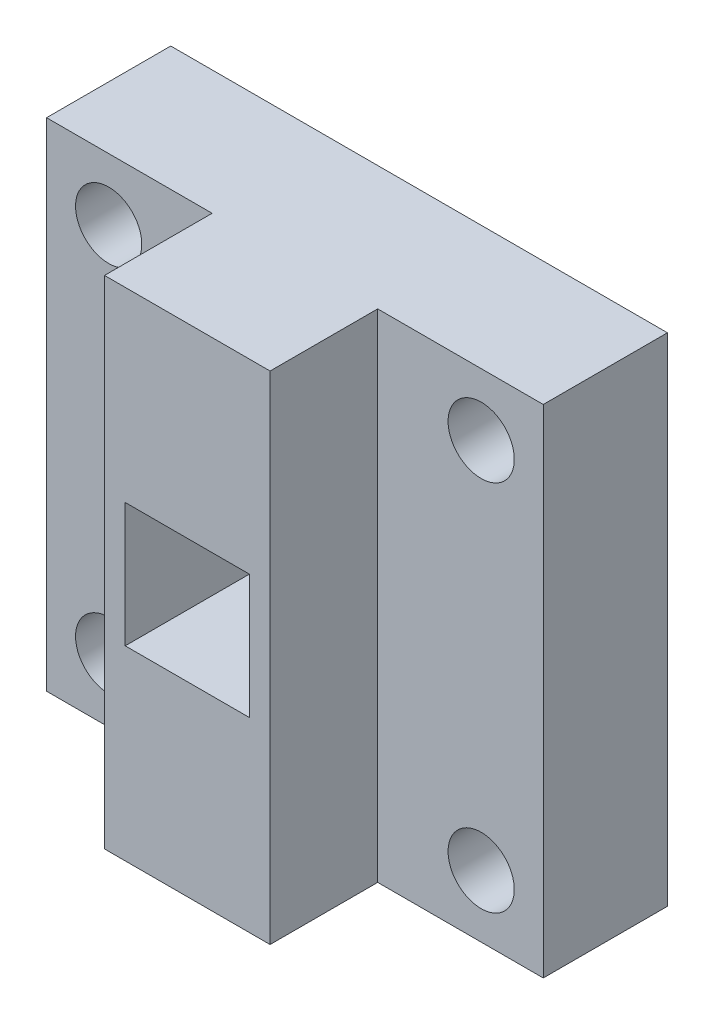
ISO-10303-21;
HEADER;
FILE_DESCRIPTION(('STEP AP214'),'2;1');
FILE_NAME('part.step','',(''),(''),'','','');
FILE_SCHEMA(('AUTOMOTIVE_DESIGN { 1 0 10303 214 1 1 1 1 }'));
ENDSEC;
DATA;
#1=APPLICATION_CONTEXT('core data for automotive mechanical design processes');
#2=APPLICATION_PROTOCOL_DEFINITION('international standard','automotive_design',2000,#1);
#3=PRODUCT_CONTEXT('',#1,'mechanical');
#4=PRODUCT('Part','Part','',(#3));
#5=PRODUCT_RELATED_PRODUCT_CATEGORY('part','',(#4));
#6=PRODUCT_DEFINITION_FORMATION('','',#4);
#7=PRODUCT_DEFINITION_CONTEXT('part definition',#1,'design');
#8=PRODUCT_DEFINITION('design','',#6,#7);
#9=PRODUCT_DEFINITION_SHAPE('','',#8);
#10=(LENGTH_UNIT() NAMED_UNIT(*) SI_UNIT(.MILLI.,.METRE.));
#11=(NAMED_UNIT(*) PLANE_ANGLE_UNIT() SI_UNIT($,.RADIAN.));
#12=(NAMED_UNIT(*) SI_UNIT($,.STERADIAN.) SOLID_ANGLE_UNIT());
#13=UNCERTAINTY_MEASURE_WITH_UNIT(LENGTH_MEASURE(1.E-05),#10,'distance_accuracy_value','');
#14=(GEOMETRIC_REPRESENTATION_CONTEXT(3) GLOBAL_UNCERTAINTY_ASSIGNED_CONTEXT((#13)) GLOBAL_UNIT_ASSIGNED_CONTEXT((#10,
#11,#12)) REPRESENTATION_CONTEXT('',''));
#15=CARTESIAN_POINT('',(0.,0.,0.));
#16=DIRECTION('',(0.,0.,1.));
#17=DIRECTION('',(1.,0.,0.));
#18=AXIS2_PLACEMENT_3D('',#15,#16,#17);
#19=CARTESIAN_POINT('',(0.,0.,0.));
#20=DIRECTION('',(0.,0.,-1.));
#21=DIRECTION('',(-1.,0.,0.));
#22=AXIS2_PLACEMENT_3D('',#19,#20,#21);
#23=PLANE('',#22);
#24=CARTESIAN_POINT('',(22.5,22.5,0.));
#25=DIRECTION('',(0.,0.,1.));
#26=DIRECTION('',(-1.,0.,0.));
#27=AXIS2_PLACEMENT_3D('',#24,#25,#26);
#28=CIRCLE('',#27,4.);
#29=CARTESIAN_POINT('',(18.5,22.5,0.));
#30=VERTEX_POINT('',#29);
#31=EDGE_CURVE('E192',#30,#30,#28,.T.);
#32=ORIENTED_EDGE('',*,*,#31,.T.);
#33=EDGE_LOOP('',(#32));
#34=FACE_BOUND('',#33,.T.);
#35=CARTESIAN_POINT('',(22.5,-22.5,0.));
#36=DIRECTION('',(0.,0.,-1.));
#37=DIRECTION('',(-1.,0.,0.));
#38=AXIS2_PLACEMENT_3D('',#35,#36,#37);
#39=CIRCLE('',#38,4.);
#40=CARTESIAN_POINT('',(18.5,-22.5,0.));
#41=VERTEX_POINT('',#40);
#42=EDGE_CURVE('E208',#41,#41,#39,.T.);
#43=ORIENTED_EDGE('',*,*,#42,.F.);
#44=EDGE_LOOP('',(#43));
#45=FACE_BOUND('',#44,.T.);
#46=DIRECTION('',(0.,1.,0.));
#47=VECTOR('',#46,1.);
#48=CARTESIAN_POINT('',(7.5,-7.5,0.));
#49=LINE('',#48,#47);
#50=CARTESIAN_POINT('',(7.5,-7.5,0.));
#51=VERTEX_POINT('',#50);
#52=CARTESIAN_POINT('',(7.5,7.5,0.));
#53=VERTEX_POINT('',#52);
#54=EDGE_CURVE('E128',#51,#53,#49,.T.);
#55=ORIENTED_EDGE('',*,*,#54,.T.);
#56=DIRECTION('',(-1.,0.,0.));
#57=VECTOR('',#56,1.);
#58=CARTESIAN_POINT('',(-7.5,7.5,0.));
#59=LINE('',#58,#57);
#60=CARTESIAN_POINT('',(-7.5,7.5,0.));
#61=VERTEX_POINT('',#60);
#62=EDGE_CURVE('E137',#53,#61,#59,.T.);
#63=ORIENTED_EDGE('',*,*,#62,.T.);
#64=DIRECTION('',(0.,-1.,0.));
#65=VECTOR('',#64,1.);
#66=CARTESIAN_POINT('',(-7.5,-7.5,0.));
#67=LINE('',#66,#65);
#68=CARTESIAN_POINT('',(-7.5,-7.5,0.));
#69=VERTEX_POINT('',#68);
#70=EDGE_CURVE('E52',#61,#69,#67,.T.);
#71=ORIENTED_EDGE('',*,*,#70,.T.);
#72=DIRECTION('',(1.,0.,0.));
#73=VECTOR('',#72,1.);
#74=CARTESIAN_POINT('',(-7.5,-7.5,0.));
#75=LINE('',#74,#73);
#76=EDGE_CURVE('E134',#69,#51,#75,.T.);
#77=ORIENTED_EDGE('',*,*,#76,.T.);
#78=EDGE_LOOP('',(#55,#63,#71,#77));
#79=FACE_BOUND('',#78,.T.);
#80=DIRECTION('',(0.,1.,0.));
#81=VECTOR('',#80,1.);
#82=CARTESIAN_POINT('',(30.,-30.,0.));
#83=LINE('',#82,#81);
#84=CARTESIAN_POINT('',(30.,-30.,0.));
#85=VERTEX_POINT('',#84);
#86=CARTESIAN_POINT('',(30.,30.,0.));
#87=VERTEX_POINT('',#86);
#88=EDGE_CURVE('E269',#85,#87,#83,.T.);
#89=ORIENTED_EDGE('',*,*,#88,.F.);
#90=DIRECTION('',(1.,0.,0.));
#91=VECTOR('',#90,1.);
#92=CARTESIAN_POINT('',(-30.,-30.,0.));
#93=LINE('',#92,#91);
#94=CARTESIAN_POINT('',(-30.,-30.,0.));
#95=VERTEX_POINT('',#94);
#96=EDGE_CURVE('E278',#95,#85,#93,.T.);
#97=ORIENTED_EDGE('',*,*,#96,.F.);
#98=DIRECTION('',(0.,-1.,0.));
#99=VECTOR('',#98,1.);
#100=CARTESIAN_POINT('',(-30.,-30.,0.));
#101=LINE('',#100,#99);
#102=CARTESIAN_POINT('',(-30.,30.,0.));
#103=VERTEX_POINT('',#102);
#104=EDGE_CURVE('E268',#103,#95,#101,.T.);
#105=ORIENTED_EDGE('',*,*,#104,.F.);
#106=DIRECTION('',(-1.,0.,0.));
#107=VECTOR('',#106,1.);
#108=CARTESIAN_POINT('',(-30.,30.,0.));
#109=LINE('',#108,#107);
#110=EDGE_CURVE('E260',#87,#103,#109,.T.);
#111=ORIENTED_EDGE('',*,*,#110,.F.);
#112=EDGE_LOOP('',(#89,#97,#105,#111));
#113=FACE_BOUND('',#112,.T.);
#114=CARTESIAN_POINT('',(-22.5,22.5,0.));
#115=DIRECTION('',(0.,0.,-1.));
#116=DIRECTION('',(1.,0.,0.));
#117=AXIS2_PLACEMENT_3D('',#114,#115,#116);
#118=CIRCLE('',#117,4.);
#119=CARTESIAN_POINT('',(-18.5,22.5,0.));
#120=VERTEX_POINT('',#119);
#121=EDGE_CURVE('E193',#120,#120,#118,.T.);
#122=ORIENTED_EDGE('',*,*,#121,.F.);
#123=EDGE_LOOP('',(#122));
#124=FACE_BOUND('',#123,.T.);
#125=CARTESIAN_POINT('',(-22.5,-22.5,0.));
#126=DIRECTION('',(0.,0.,1.));
#127=DIRECTION('',(1.,0.,0.));
#128=AXIS2_PLACEMENT_3D('',#125,#126,#127);
#129=CIRCLE('',#128,4.);
#130=CARTESIAN_POINT('',(-18.5,-22.5,0.));
#131=VERTEX_POINT('',#130);
#132=EDGE_CURVE('E204',#131,#131,#129,.T.);
#133=ORIENTED_EDGE('',*,*,#132,.T.);
#134=EDGE_LOOP('',(#133));
#135=FACE_BOUND('',#134,.T.);
#136=ADVANCED_FACE('F35',(#34,#45,#79,#113,#124,#135),#23,.T.);
#137=CARTESIAN_POINT('',(0.,0.,15.));
#138=DIRECTION('',(0.,0.,-1.));
#139=DIRECTION('',(-1.,0.,0.));
#140=AXIS2_PLACEMENT_3D('',#137,#138,#139);
#141=PLANE('',#140);
#142=DIRECTION('',(0.,-1.,0.));
#143=VECTOR('',#142,1.);
#144=CARTESIAN_POINT('',(-10.,-30.,15.));
#145=LINE('',#144,#143);
#146=CARTESIAN_POINT('',(-10.,30.,15.));
#147=VERTEX_POINT('',#146);
#148=CARTESIAN_POINT('',(-10.,-30.,15.));
#149=VERTEX_POINT('',#148);
#150=EDGE_CURVE('E169',#147,#149,#145,.T.);
#151=ORIENTED_EDGE('',*,*,#150,.F.);
#152=DIRECTION('',(-1.,0.,0.));
#153=VECTOR('',#152,1.);
#154=CARTESIAN_POINT('',(-30.,30.,15.));
#155=LINE('',#154,#153);
#156=CARTESIAN_POINT('',(-30.,30.,15.));
#157=VERTEX_POINT('',#156);
#158=EDGE_CURVE('E292',#147,#157,#155,.T.);
#159=ORIENTED_EDGE('',*,*,#158,.T.);
#160=DIRECTION('',(0.,-1.,0.));
#161=VECTOR('',#160,1.);
#162=CARTESIAN_POINT('',(-30.,-30.,15.));
#163=LINE('',#162,#161);
#164=CARTESIAN_POINT('',(-30.,-30.,15.));
#165=VERTEX_POINT('',#164);
#166=EDGE_CURVE('E273',#157,#165,#163,.T.);
#167=ORIENTED_EDGE('',*,*,#166,.T.);
#168=DIRECTION('',(1.,0.,0.));
#169=VECTOR('',#168,1.);
#170=CARTESIAN_POINT('',(-30.,-30.,15.));
#171=LINE('',#170,#169);
#172=EDGE_CURVE('E287',#165,#149,#171,.T.);
#173=ORIENTED_EDGE('',*,*,#172,.T.);
#174=EDGE_LOOP('',(#151,#159,#167,#173));
#175=FACE_BOUND('',#174,.T.);
#176=CARTESIAN_POINT('',(-22.5,22.5,15.));
#177=DIRECTION('',(0.,0.,-1.));
#178=DIRECTION('',(-1.,0.,0.));
#179=AXIS2_PLACEMENT_3D('',#176,#177,#178);
#180=CIRCLE('',#179,4.);
#181=CARTESIAN_POINT('',(-26.5,22.5,15.));
#182=VERTEX_POINT('',#181);
#183=EDGE_CURVE('E190',#182,#182,#180,.T.);
#184=ORIENTED_EDGE('',*,*,#183,.T.);
#185=EDGE_LOOP('',(#184));
#186=FACE_BOUND('',#185,.T.);
#187=CARTESIAN_POINT('',(-22.5,-22.5,15.));
#188=DIRECTION('',(0.,0.,-1.));
#189=DIRECTION('',(-1.,0.,0.));
#190=AXIS2_PLACEMENT_3D('',#187,#188,#189);
#191=CIRCLE('',#190,4.);
#192=CARTESIAN_POINT('',(-26.5,-22.5,15.));
#193=VERTEX_POINT('',#192);
#194=EDGE_CURVE('E39',#193,#193,#191,.F.);
#195=ORIENTED_EDGE('',*,*,#194,.F.);
#196=EDGE_LOOP('',(#195));
#197=FACE_BOUND('',#196,.T.);
#198=ADVANCED_FACE('F233',(#175,#186,#197),#141,.F.);
#199=DIRECTION('',(0.,1.,0.));
#200=VECTOR('',#199,1.);
#201=CARTESIAN_POINT('',(10.,-30.,15.));
#202=LINE('',#201,#200);
#203=CARTESIAN_POINT('',(10.,-30.,15.));
#204=VERTEX_POINT('',#203);
#205=CARTESIAN_POINT('',(10.,30.,15.));
#206=VERTEX_POINT('',#205);
#207=EDGE_CURVE('E161',#204,#206,#202,.T.);
#208=ORIENTED_EDGE('',*,*,#207,.F.);
#209=CARTESIAN_POINT('',(30.,-30.,15.));
#210=VERTEX_POINT('',#209);
#211=EDGE_CURVE('E298',#204,#210,#171,.T.);
#212=ORIENTED_EDGE('',*,*,#211,.T.);
#213=DIRECTION('',(0.,1.,0.));
#214=VECTOR('',#213,1.);
#215=CARTESIAN_POINT('',(30.,-30.,15.));
#216=LINE('',#215,#214);
#217=CARTESIAN_POINT('',(30.,30.,15.));
#218=VERTEX_POINT('',#217);
#219=EDGE_CURVE('E280',#210,#218,#216,.T.);
#220=ORIENTED_EDGE('',*,*,#219,.T.);
#221=EDGE_CURVE('E289',#218,#206,#155,.T.);
#222=ORIENTED_EDGE('',*,*,#221,.T.);
#223=EDGE_LOOP('',(#208,#212,#220,#222));
#224=FACE_BOUND('',#223,.T.);
#225=CARTESIAN_POINT('',(22.5,-22.5,15.));
#226=DIRECTION('',(0.,0.,-1.));
#227=DIRECTION('',(-1.,0.,0.));
#228=AXIS2_PLACEMENT_3D('',#225,#226,#227);
#229=CIRCLE('',#228,4.);
#230=CARTESIAN_POINT('',(18.5,-22.5,15.));
#231=VERTEX_POINT('',#230);
#232=EDGE_CURVE('E149',#231,#231,#229,.T.);
#233=ORIENTED_EDGE('',*,*,#232,.T.);
#234=EDGE_LOOP('',(#233));
#235=FACE_BOUND('',#234,.T.);
#236=CARTESIAN_POINT('',(22.5,22.5,15.));
#237=DIRECTION('',(0.,0.,-1.));
#238=DIRECTION('',(-1.,0.,0.));
#239=AXIS2_PLACEMENT_3D('',#236,#237,#238);
#240=CIRCLE('',#239,4.);
#241=CARTESIAN_POINT('',(18.5,22.5,15.));
#242=VERTEX_POINT('',#241);
#243=EDGE_CURVE('E197',#242,#242,#240,.F.);
#244=ORIENTED_EDGE('',*,*,#243,.F.);
#245=EDGE_LOOP('',(#244));
#246=FACE_BOUND('',#245,.T.);
#247=ADVANCED_FACE('F215',(#224,#235,#246),#141,.F.);
#248=CARTESIAN_POINT('',(30.,-30.,15.));
#249=DIRECTION('',(-1.,0.,0.));
#250=DIRECTION('',(0.,0.,1.));
#251=AXIS2_PLACEMENT_3D('',#248,#249,#250);
#252=PLANE('',#251);
#253=ORIENTED_EDGE('',*,*,#88,.T.);
#254=DIRECTION('',(0.,0.,-1.));
#255=VECTOR('',#254,1.);
#256=CARTESIAN_POINT('',(30.,30.,15.));
#257=LINE('',#256,#255);
#258=EDGE_CURVE('E11',#218,#87,#257,.T.);
#259=ORIENTED_EDGE('',*,*,#258,.F.);
#260=ORIENTED_EDGE('',*,*,#219,.F.);
#261=DIRECTION('',(0.,0.,-1.));
#262=VECTOR('',#261,1.);
#263=CARTESIAN_POINT('',(30.,-30.,15.));
#264=LINE('',#263,#262);
#265=EDGE_CURVE('E284',#210,#85,#264,.T.);
#266=ORIENTED_EDGE('',*,*,#265,.T.);
#267=EDGE_LOOP('',(#253,#259,#260,#266));
#268=FACE_BOUND('',#267,.T.);
#269=ADVANCED_FACE('F37',(#268),#252,.F.);
#270=CARTESIAN_POINT('',(-30.,30.,15.));
#271=DIRECTION('',(0.,-1.,0.));
#272=DIRECTION('',(0.,0.,-1.));
#273=AXIS2_PLACEMENT_3D('',#270,#271,#272);
#274=PLANE('',#273);
#275=ORIENTED_EDGE('',*,*,#110,.T.);
#276=DIRECTION('',(0.,0.,-1.));
#277=VECTOR('',#276,1.);
#278=CARTESIAN_POINT('',(-30.,30.,15.));
#279=LINE('',#278,#277);
#280=EDGE_CURVE('E44',#157,#103,#279,.T.);
#281=ORIENTED_EDGE('',*,*,#280,.F.);
#282=ORIENTED_EDGE('',*,*,#158,.F.);
#283=DIRECTION('',(0.,0.,-1.));
#284=VECTOR('',#283,1.);
#285=CARTESIAN_POINT('',(-10.,30.,28.));
#286=LINE('',#285,#284);
#287=CARTESIAN_POINT('',(-10.,30.,28.));
#288=VERTEX_POINT('',#287);
#289=EDGE_CURVE('E313',#288,#147,#286,.T.);
#290=ORIENTED_EDGE('',*,*,#289,.F.);
#291=DIRECTION('',(-1.,0.,0.));
#292=VECTOR('',#291,1.);
#293=CARTESIAN_POINT('',(-10.,30.,28.));
#294=LINE('',#293,#292);
#295=CARTESIAN_POINT('',(10.,30.,28.));
#296=VERTEX_POINT('',#295);
#297=EDGE_CURVE('E168',#296,#288,#294,.T.);
#298=ORIENTED_EDGE('',*,*,#297,.F.);
#299=DIRECTION('',(0.,0.,-1.));
#300=VECTOR('',#299,1.);
#301=CARTESIAN_POINT('',(10.,30.,28.));
#302=LINE('',#301,#300);
#303=EDGE_CURVE('E319',#296,#206,#302,.T.);
#304=ORIENTED_EDGE('',*,*,#303,.T.);
#305=ORIENTED_EDGE('',*,*,#221,.F.);
#306=ORIENTED_EDGE('',*,*,#258,.T.);
#307=EDGE_LOOP('',(#275,#281,#282,#290,#298,#304,#305,#306));
#308=FACE_BOUND('',#307,.T.);
#309=ADVANCED_FACE('F251',(#308),#274,.F.);
#310=CARTESIAN_POINT('',(-30.,-30.,15.));
#311=DIRECTION('',(1.,0.,0.));
#312=DIRECTION('',(0.,0.,-1.));
#313=AXIS2_PLACEMENT_3D('',#310,#311,#312);
#314=PLANE('',#313);
#315=ORIENTED_EDGE('',*,*,#104,.T.);
#316=DIRECTION('',(0.,0.,-1.));
#317=VECTOR('',#316,1.);
#318=CARTESIAN_POINT('',(-30.,-30.,15.));
#319=LINE('',#318,#317);
#320=EDGE_CURVE('E274',#165,#95,#319,.T.);
#321=ORIENTED_EDGE('',*,*,#320,.F.);
#322=ORIENTED_EDGE('',*,*,#166,.F.);
#323=ORIENTED_EDGE('',*,*,#280,.T.);
#324=EDGE_LOOP('',(#315,#321,#322,#323));
#325=FACE_BOUND('',#324,.T.);
#326=ADVANCED_FACE('F248',(#325),#314,.F.);
#327=CARTESIAN_POINT('',(-30.,-30.,15.));
#328=DIRECTION('',(0.,1.,0.));
#329=DIRECTION('',(0.,0.,1.));
#330=AXIS2_PLACEMENT_3D('',#327,#328,#329);
#331=PLANE('',#330);
#332=ORIENTED_EDGE('',*,*,#96,.T.);
#333=ORIENTED_EDGE('',*,*,#265,.F.);
#334=ORIENTED_EDGE('',*,*,#211,.F.);
#335=DIRECTION('',(0.,0.,-1.));
#336=VECTOR('',#335,1.);
#337=CARTESIAN_POINT('',(10.,-30.,28.));
#338=LINE('',#337,#336);
#339=CARTESIAN_POINT('',(10.,-30.,28.));
#340=VERTEX_POINT('',#339);
#341=EDGE_CURVE('E175',#340,#204,#338,.T.);
#342=ORIENTED_EDGE('',*,*,#341,.F.);
#343=DIRECTION('',(1.,0.,0.));
#344=VECTOR('',#343,1.);
#345=CARTESIAN_POINT('',(-10.,-30.,28.));
#346=LINE('',#345,#344);
#347=CARTESIAN_POINT('',(-10.,-30.,28.));
#348=VERTEX_POINT('',#347);
#349=EDGE_CURVE('E173',#348,#340,#346,.T.);
#350=ORIENTED_EDGE('',*,*,#349,.F.);
#351=DIRECTION('',(0.,0.,-1.));
#352=VECTOR('',#351,1.);
#353=CARTESIAN_POINT('',(-10.,-30.,28.));
#354=LINE('',#353,#352);
#355=EDGE_CURVE('E188',#348,#149,#354,.T.);
#356=ORIENTED_EDGE('',*,*,#355,.T.);
#357=ORIENTED_EDGE('',*,*,#172,.F.);
#358=ORIENTED_EDGE('',*,*,#320,.T.);
#359=EDGE_LOOP('',(#332,#333,#334,#342,#350,#356,#357,#358));
#360=FACE_BOUND('',#359,.T.);
#361=ADVANCED_FACE('F244',(#360),#331,.F.);
#362=CARTESIAN_POINT('',(10.,-30.,28.));
#363=DIRECTION('',(-1.,0.,0.));
#364=DIRECTION('',(0.,0.,1.));
#365=AXIS2_PLACEMENT_3D('',#362,#363,#364);
#366=PLANE('',#365);
#367=ORIENTED_EDGE('',*,*,#207,.T.);
#368=ORIENTED_EDGE('',*,*,#303,.F.);
#369=DIRECTION('',(0.,1.,0.));
#370=VECTOR('',#369,1.);
#371=CARTESIAN_POINT('',(10.,-30.,28.));
#372=LINE('',#371,#370);
#373=EDGE_CURVE('E165',#340,#296,#372,.T.);
#374=ORIENTED_EDGE('',*,*,#373,.F.);
#375=ORIENTED_EDGE('',*,*,#341,.T.);
#376=EDGE_LOOP('',(#367,#368,#374,#375));
#377=FACE_BOUND('',#376,.T.);
#378=ADVANCED_FACE('F247',(#377),#366,.F.);
#379=CARTESIAN_POINT('',(-10.,-30.,28.));
#380=DIRECTION('',(1.,0.,0.));
#381=DIRECTION('',(0.,0.,-1.));
#382=AXIS2_PLACEMENT_3D('',#379,#380,#381);
#383=PLANE('',#382);
#384=ORIENTED_EDGE('',*,*,#150,.T.);
#385=ORIENTED_EDGE('',*,*,#355,.F.);
#386=DIRECTION('',(0.,-1.,0.));
#387=VECTOR('',#386,1.);
#388=CARTESIAN_POINT('',(-10.,-30.,28.));
#389=LINE('',#388,#387);
#390=EDGE_CURVE('E171',#288,#348,#389,.T.);
#391=ORIENTED_EDGE('',*,*,#390,.F.);
#392=ORIENTED_EDGE('',*,*,#289,.T.);
#393=EDGE_LOOP('',(#384,#385,#391,#392));
#394=FACE_BOUND('',#393,.T.);
#395=ADVANCED_FACE('F316',(#394),#383,.F.);
#396=CARTESIAN_POINT('',(0.,0.,28.));
#397=DIRECTION('',(0.,0.,-1.));
#398=DIRECTION('',(-1.,0.,0.));
#399=AXIS2_PLACEMENT_3D('',#396,#397,#398);
#400=PLANE('',#399);
#401=DIRECTION('',(-1.,0.,0.));
#402=VECTOR('',#401,1.);
#403=CARTESIAN_POINT('',(-7.5,7.5,28.));
#404=LINE('',#403,#402);
#405=CARTESIAN_POINT('',(7.5,7.5,28.));
#406=VERTEX_POINT('',#405);
#407=CARTESIAN_POINT('',(-7.5,7.5,28.));
#408=VERTEX_POINT('',#407);
#409=EDGE_CURVE('E155',#406,#408,#404,.T.);
#410=ORIENTED_EDGE('',*,*,#409,.F.);
#411=DIRECTION('',(0.,1.,0.));
#412=VECTOR('',#411,1.);
#413=CARTESIAN_POINT('',(7.5,-7.5,28.));
#414=LINE('',#413,#412);
#415=CARTESIAN_POINT('',(7.5,-7.5,28.));
#416=VERTEX_POINT('',#415);
#417=EDGE_CURVE('E60',#416,#406,#414,.T.);
#418=ORIENTED_EDGE('',*,*,#417,.F.);
#419=DIRECTION('',(1.,0.,0.));
#420=VECTOR('',#419,1.);
#421=CARTESIAN_POINT('',(-7.5,-7.5,28.));
#422=LINE('',#421,#420);
#423=CARTESIAN_POINT('',(-7.5,-7.5,28.));
#424=VERTEX_POINT('',#423);
#425=EDGE_CURVE('E143',#424,#416,#422,.T.);
#426=ORIENTED_EDGE('',*,*,#425,.F.);
#427=DIRECTION('',(0.,-1.,0.));
#428=VECTOR('',#427,1.);
#429=CARTESIAN_POINT('',(-7.5,-7.5,28.));
#430=LINE('',#429,#428);
#431=EDGE_CURVE('E146',#408,#424,#430,.T.);
#432=ORIENTED_EDGE('',*,*,#431,.F.);
#433=EDGE_LOOP('',(#410,#418,#426,#432));
#434=FACE_BOUND('',#433,.T.);
#435=ORIENTED_EDGE('',*,*,#373,.T.);
#436=ORIENTED_EDGE('',*,*,#297,.T.);
#437=ORIENTED_EDGE('',*,*,#390,.T.);
#438=ORIENTED_EDGE('',*,*,#349,.T.);
#439=EDGE_LOOP('',(#435,#436,#437,#438));
#440=FACE_BOUND('',#439,.T.);
#441=ADVANCED_FACE('F330',(#434,#440),#400,.F.);
#442=CARTESIAN_POINT('',(7.5,-7.5,0.));
#443=DIRECTION('',(1.,0.,0.));
#444=DIRECTION('',(0.,0.,-1.));
#445=AXIS2_PLACEMENT_3D('',#442,#443,#444);
#446=PLANE('',#445);
#447=ORIENTED_EDGE('',*,*,#417,.T.);
#448=DIRECTION('',(0.,0.,1.));
#449=VECTOR('',#448,1.);
#450=CARTESIAN_POINT('',(7.5,7.5,0.));
#451=LINE('',#450,#449);
#452=EDGE_CURVE('E124',#53,#406,#451,.T.);
#453=ORIENTED_EDGE('',*,*,#452,.F.);
#454=ORIENTED_EDGE('',*,*,#54,.F.);
#455=DIRECTION('',(0.,0.,1.));
#456=VECTOR('',#455,1.);
#457=CARTESIAN_POINT('',(7.5,-7.5,0.));
#458=LINE('',#457,#456);
#459=EDGE_CURVE('E159',#51,#416,#458,.T.);
#460=ORIENTED_EDGE('',*,*,#459,.T.);
#461=EDGE_LOOP('',(#447,#453,#454,#460));
#462=FACE_BOUND('',#461,.T.);
#463=ADVANCED_FACE('F126',(#462),#446,.F.);
#464=CARTESIAN_POINT('',(-7.5,-7.5,0.));
#465=DIRECTION('',(0.,-1.,0.));
#466=DIRECTION('',(0.,0.,-1.));
#467=AXIS2_PLACEMENT_3D('',#464,#465,#466);
#468=PLANE('',#467);
#469=ORIENTED_EDGE('',*,*,#425,.T.);
#470=ORIENTED_EDGE('',*,*,#459,.F.);
#471=ORIENTED_EDGE('',*,*,#76,.F.);
#472=DIRECTION('',(0.,0.,1.));
#473=VECTOR('',#472,1.);
#474=CARTESIAN_POINT('',(-7.5,-7.5,0.));
#475=LINE('',#474,#473);
#476=EDGE_CURVE('E162',#69,#424,#475,.T.);
#477=ORIENTED_EDGE('',*,*,#476,.T.);
#478=EDGE_LOOP('',(#469,#470,#471,#477));
#479=FACE_BOUND('',#478,.T.);
#480=ADVANCED_FACE('F343',(#479),#468,.F.);
#481=CARTESIAN_POINT('',(-7.5,-7.5,0.));
#482=DIRECTION('',(-1.,0.,0.));
#483=DIRECTION('',(0.,0.,1.));
#484=AXIS2_PLACEMENT_3D('',#481,#482,#483);
#485=PLANE('',#484);
#486=ORIENTED_EDGE('',*,*,#431,.T.);
#487=ORIENTED_EDGE('',*,*,#476,.F.);
#488=ORIENTED_EDGE('',*,*,#70,.F.);
#489=DIRECTION('',(0.,0.,1.));
#490=VECTOR('',#489,1.);
#491=CARTESIAN_POINT('',(-7.5,7.5,0.));
#492=LINE('',#491,#490);
#493=EDGE_CURVE('E133',#61,#408,#492,.T.);
#494=ORIENTED_EDGE('',*,*,#493,.T.);
#495=EDGE_LOOP('',(#486,#487,#488,#494));
#496=FACE_BOUND('',#495,.T.);
#497=ADVANCED_FACE('F229',(#496),#485,.F.);
#498=CARTESIAN_POINT('',(-7.5,7.5,0.));
#499=DIRECTION('',(0.,1.,0.));
#500=DIRECTION('',(0.,0.,1.));
#501=AXIS2_PLACEMENT_3D('',#498,#499,#500);
#502=PLANE('',#501);
#503=ORIENTED_EDGE('',*,*,#409,.T.);
#504=ORIENTED_EDGE('',*,*,#493,.F.);
#505=ORIENTED_EDGE('',*,*,#62,.F.);
#506=ORIENTED_EDGE('',*,*,#452,.T.);
#507=EDGE_LOOP('',(#503,#504,#505,#506));
#508=FACE_BOUND('',#507,.T.);
#509=ADVANCED_FACE('F138',(#508),#502,.F.);
#510=CARTESIAN_POINT('',(22.5,-22.5,28.000025));
#511=DIRECTION('',(0.,0.,-1.));
#512=DIRECTION('',(-1.,0.,0.));
#513=AXIS2_PLACEMENT_3D('',#510,#511,#512);
#514=CYLINDRICAL_SURFACE('',#513,4.);
#515=ORIENTED_EDGE('',*,*,#42,.T.);
#516=EDGE_LOOP('',(#515));
#517=FACE_BOUND('',#516,.T.);
#518=ORIENTED_EDGE('',*,*,#232,.F.);
#519=EDGE_LOOP('',(#518));
#520=FACE_BOUND('',#519,.T.);
#521=ADVANCED_FACE('F218',(#517,#520),#514,.F.);
#522=CARTESIAN_POINT('',(22.5,22.5,28.000025));
#523=DIRECTION('',(0.,0.,-1.));
#524=DIRECTION('',(-1.,0.,0.));
#525=AXIS2_PLACEMENT_3D('',#522,#523,#524);
#526=CYLINDRICAL_SURFACE('',#525,4.);
#527=ORIENTED_EDGE('',*,*,#31,.F.);
#528=EDGE_LOOP('',(#527));
#529=FACE_BOUND('',#528,.T.);
#530=ORIENTED_EDGE('',*,*,#243,.T.);
#531=EDGE_LOOP('',(#530));
#532=FACE_BOUND('',#531,.T.);
#533=ADVANCED_FACE('F220',(#529,#532),#526,.F.);
#534=CARTESIAN_POINT('',(-22.5,22.5,28.000025));
#535=DIRECTION('',(0.,0.,-1.));
#536=DIRECTION('',(-1.,0.,0.));
#537=AXIS2_PLACEMENT_3D('',#534,#535,#536);
#538=CYLINDRICAL_SURFACE('',#537,4.);
#539=ORIENTED_EDGE('',*,*,#121,.T.);
#540=EDGE_LOOP('',(#539));
#541=FACE_BOUND('',#540,.T.);
#542=ORIENTED_EDGE('',*,*,#183,.F.);
#543=EDGE_LOOP('',(#542));
#544=FACE_BOUND('',#543,.T.);
#545=ADVANCED_FACE('F226',(#541,#544),#538,.F.);
#546=CARTESIAN_POINT('',(-22.5,-22.5,28.000025));
#547=DIRECTION('',(0.,0.,-1.));
#548=DIRECTION('',(-1.,0.,0.));
#549=AXIS2_PLACEMENT_3D('',#546,#547,#548);
#550=CYLINDRICAL_SURFACE('',#549,4.);
#551=ORIENTED_EDGE('',*,*,#132,.F.);
#552=EDGE_LOOP('',(#551));
#553=FACE_BOUND('',#552,.T.);
#554=ORIENTED_EDGE('',*,*,#194,.T.);
#555=EDGE_LOOP('',(#554));
#556=FACE_BOUND('',#555,.T.);
#557=ADVANCED_FACE('F398',(#553,#556),#550,.F.);
#558=CLOSED_SHELL('',(#136,#198,#247,#269,#309,#326,#361,#378,#395,#441,#463,#480,#497,#509,
#521,#533,#545,#557));
#559=MANIFOLD_SOLID_BREP('B2',#558);
#560=ADVANCED_BREP_SHAPE_REPRESENTATION('',(#18,#559),#14);
#561=SHAPE_DEFINITION_REPRESENTATION(#9,#560);
ENDSEC;
END-ISO-10303-21;
